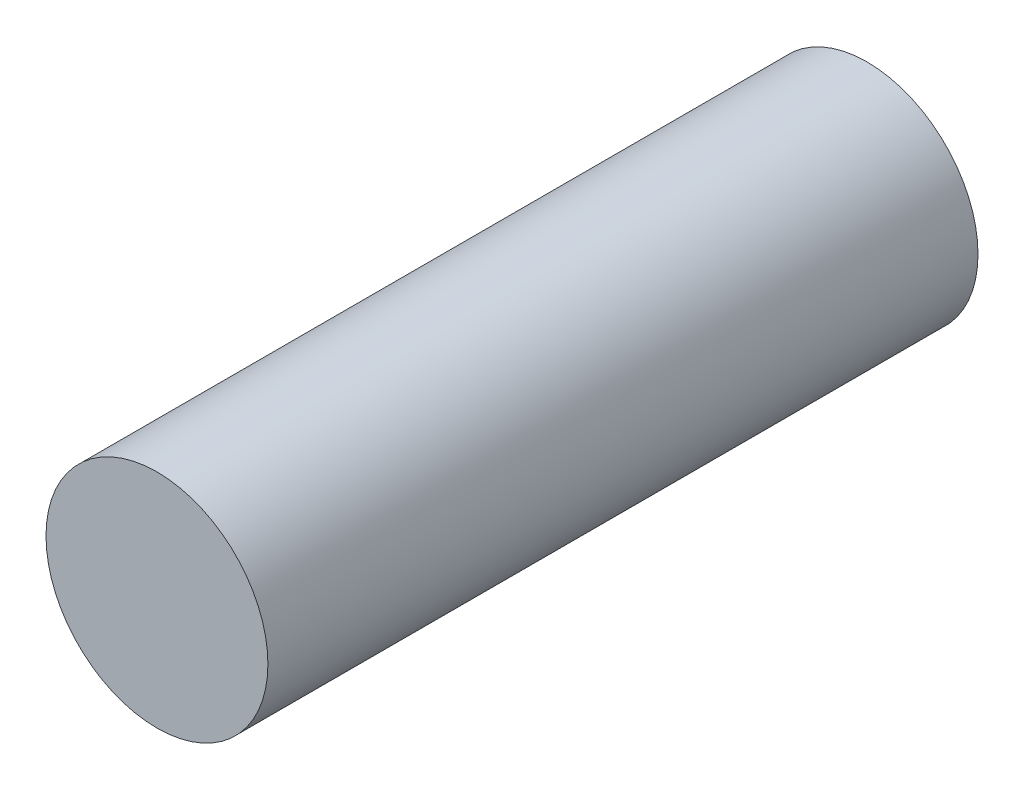
ISO-10303-21;
HEADER;
FILE_DESCRIPTION(('STEP AP214'),'2;1');
FILE_NAME('part.step','',(''),(''),'','','');
FILE_SCHEMA(('AUTOMOTIVE_DESIGN { 1 0 10303 214 1 1 1 1 }'));
ENDSEC;
DATA;
#1=APPLICATION_CONTEXT('core data for automotive mechanical design processes');
#2=APPLICATION_PROTOCOL_DEFINITION('international standard','automotive_design',2000,#1);
#3=PRODUCT_CONTEXT('',#1,'mechanical');
#4=PRODUCT('Part','Part','',(#3));
#5=PRODUCT_RELATED_PRODUCT_CATEGORY('part','',(#4));
#6=PRODUCT_DEFINITION_FORMATION('','',#4);
#7=PRODUCT_DEFINITION_CONTEXT('part definition',#1,'design');
#8=PRODUCT_DEFINITION('design','',#6,#7);
#9=PRODUCT_DEFINITION_SHAPE('','',#8);
#10=(LENGTH_UNIT() NAMED_UNIT(*) SI_UNIT(.MILLI.,.METRE.));
#11=(NAMED_UNIT(*) PLANE_ANGLE_UNIT() SI_UNIT($,.RADIAN.));
#12=(NAMED_UNIT(*) SI_UNIT($,.STERADIAN.) SOLID_ANGLE_UNIT());
#13=UNCERTAINTY_MEASURE_WITH_UNIT(LENGTH_MEASURE(1.E-05),#10,'distance_accuracy_value','');
#14=(GEOMETRIC_REPRESENTATION_CONTEXT(3) GLOBAL_UNCERTAINTY_ASSIGNED_CONTEXT((#13)) GLOBAL_UNIT_ASSIGNED_CONTEXT((#10,
#11,#12)) REPRESENTATION_CONTEXT('',''));
#15=CARTESIAN_POINT('',(0.,0.,0.));
#16=DIRECTION('',(0.,0.,1.));
#17=DIRECTION('',(1.,0.,0.));
#18=AXIS2_PLACEMENT_3D('',#15,#16,#17);
#19=CARTESIAN_POINT('',(0.,0.,16.));
#20=DIRECTION('',(0.,0.,-1.));
#21=DIRECTION('',(-1.,0.,0.));
#22=AXIS2_PLACEMENT_3D('',#19,#20,#21);
#23=CYLINDRICAL_SURFACE('',#22,2.5);
#24=CARTESIAN_POINT('',(0.,0.,16.));
#25=DIRECTION('',(0.,0.,1.));
#26=DIRECTION('',(1.,0.,0.));
#27=AXIS2_PLACEMENT_3D('',#24,#25,#26);
#28=CIRCLE('',#27,2.5);
#29=CARTESIAN_POINT('',(2.5,0.,16.));
#30=VERTEX_POINT('',#29);
#31=EDGE_CURVE('E10',#30,#30,#28,.T.);
#32=ORIENTED_EDGE('',*,*,#31,.F.);
#33=EDGE_LOOP('',(#32));
#34=FACE_BOUND('',#33,.T.);
#35=CARTESIAN_POINT('',(0.,0.,0.));
#36=DIRECTION('',(0.,0.,1.));
#37=DIRECTION('',(1.,0.,0.));
#38=AXIS2_PLACEMENT_3D('',#35,#36,#37);
#39=CIRCLE('',#38,2.5);
#40=CARTESIAN_POINT('',(2.5,0.,0.));
#41=VERTEX_POINT('',#40);
#42=EDGE_CURVE('E46',#41,#41,#39,.T.);
#43=ORIENTED_EDGE('',*,*,#42,.T.);
#44=EDGE_LOOP('',(#43));
#45=FACE_BOUND('',#44,.T.);
#46=ADVANCED_FACE('F43',(#34,#45),#23,.T.);
#47=CARTESIAN_POINT('',(0.,0.,16.));
#48=DIRECTION('',(0.,0.,1.));
#49=DIRECTION('',(1.,0.,0.));
#50=AXIS2_PLACEMENT_3D('',#47,#48,#49);
#51=PLANE('',#50);
#52=ORIENTED_EDGE('',*,*,#31,.T.);
#53=EDGE_LOOP('',(#52));
#54=FACE_BOUND('',#53,.T.);
#55=ADVANCED_FACE('F58',(#54),#51,.T.);
#56=CARTESIAN_POINT('',(0.,0.,0.));
#57=DIRECTION('',(0.,0.,1.));
#58=DIRECTION('',(1.,0.,0.));
#59=AXIS2_PLACEMENT_3D('',#56,#57,#58);
#60=PLANE('',#59);
#61=ORIENTED_EDGE('',*,*,#42,.F.);
#62=EDGE_LOOP('',(#61));
#63=FACE_BOUND('',#62,.T.);
#64=ADVANCED_FACE('F59',(#63),#60,.F.);
#65=CLOSED_SHELL('',(#46,#55,#64));
#66=MANIFOLD_SOLID_BREP('B2',#65);
#67=ADVANCED_BREP_SHAPE_REPRESENTATION('',(#18,#66),#14);
#68=SHAPE_DEFINITION_REPRESENTATION(#9,#67);
ENDSEC;
END-ISO-10303-21;
